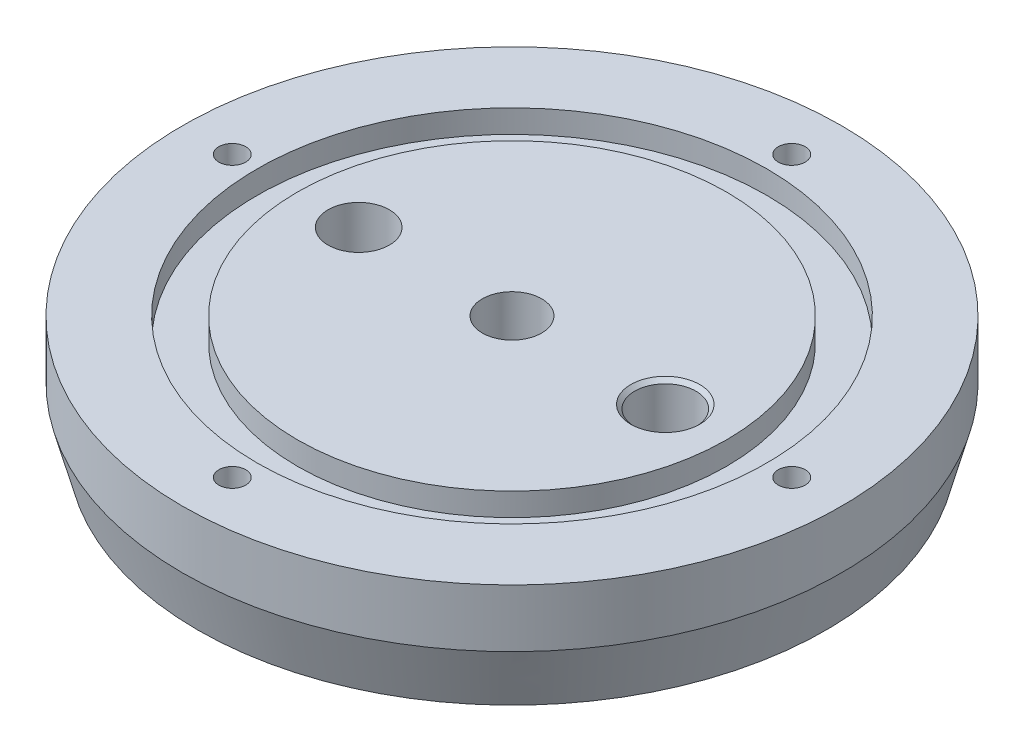
ISO-10303-21;
HEADER;
FILE_DESCRIPTION(('STEP AP214'),'2;1');
FILE_NAME('part.step','',(''),(''),'','','');
FILE_SCHEMA(('AUTOMOTIVE_DESIGN { 1 0 10303 214 1 1 1 1 }'));
ENDSEC;
DATA;
#1=APPLICATION_CONTEXT('core data for automotive mechanical design processes');
#2=APPLICATION_PROTOCOL_DEFINITION('international standard','automotive_design',2000,#1);
#3=PRODUCT_CONTEXT('',#1,'mechanical');
#4=PRODUCT('Part','Part','',(#3));
#5=PRODUCT_RELATED_PRODUCT_CATEGORY('part','',(#4));
#6=PRODUCT_DEFINITION_FORMATION('','',#4);
#7=PRODUCT_DEFINITION_CONTEXT('part definition',#1,'design');
#8=PRODUCT_DEFINITION('design','',#6,#7);
#9=PRODUCT_DEFINITION_SHAPE('','',#8);
#10=(LENGTH_UNIT() NAMED_UNIT(*) SI_UNIT(.MILLI.,.METRE.));
#11=(NAMED_UNIT(*) PLANE_ANGLE_UNIT() SI_UNIT($,.RADIAN.));
#12=(NAMED_UNIT(*) SI_UNIT($,.STERADIAN.) SOLID_ANGLE_UNIT());
#13=UNCERTAINTY_MEASURE_WITH_UNIT(LENGTH_MEASURE(1.E-05),#10,'distance_accuracy_value','');
#14=(GEOMETRIC_REPRESENTATION_CONTEXT(3) GLOBAL_UNCERTAINTY_ASSIGNED_CONTEXT((#13)) GLOBAL_UNIT_ASSIGNED_CONTEXT((#10,
#11,#12)) REPRESENTATION_CONTEXT('',''));
#15=CARTESIAN_POINT('',(0.,0.,0.));
#16=DIRECTION('',(0.,0.,1.));
#17=DIRECTION('',(1.,0.,0.));
#18=AXIS2_PLACEMENT_3D('',#15,#16,#17);
#19=CARTESIAN_POINT('',(0.,15.,0.));
#20=DIRECTION('',(0.,1.,0.));
#21=DIRECTION('',(0.,0.,1.));
#22=AXIS2_PLACEMENT_3D('',#19,#20,#21);
#23=PLANE('',#22);
#24=CARTESIAN_POINT('',(20.,15.,0.));
#25=DIRECTION('',(0.,1.,0.));
#26=DIRECTION('',(0.,0.,1.));
#27=AXIS2_PLACEMENT_3D('',#24,#25,#26);
#28=CIRCLE('',#27,4.5);
#29=CARTESIAN_POINT('',(20.,15.,4.5));
#30=VERTEX_POINT('',#29);
#31=EDGE_CURVE('E42',#30,#30,#28,.F.);
#32=ORIENTED_EDGE('',*,*,#31,.T.);
#33=EDGE_LOOP('',(#32));
#34=FACE_BOUND('',#33,.T.);
#35=CARTESIAN_POINT('',(-20.,15.,0.));
#36=DIRECTION('',(0.,-1.,0.));
#37=DIRECTION('',(0.,0.,-1.));
#38=AXIS2_PLACEMENT_3D('',#35,#36,#37);
#39=CIRCLE('',#38,4.);
#40=CARTESIAN_POINT('',(-20.,15.,-4.));
#41=VERTEX_POINT('',#40);
#42=EDGE_CURVE('E72',#41,#41,#39,.T.);
#43=ORIENTED_EDGE('',*,*,#42,.T.);
#44=EDGE_LOOP('',(#43));
#45=FACE_BOUND('',#44,.T.);
#46=CARTESIAN_POINT('',(0.,15.,0.));
#47=DIRECTION('',(0.,1.,0.));
#48=DIRECTION('',(0.,0.,1.));
#49=AXIS2_PLACEMENT_3D('',#46,#47,#48);
#50=CIRCLE('',#49,3.875);
#51=CARTESIAN_POINT('',(0.,15.,3.875));
#52=VERTEX_POINT('',#51);
#53=EDGE_CURVE('E75',#52,#52,#50,.T.);
#54=ORIENTED_EDGE('',*,*,#53,.F.);
#55=EDGE_LOOP('',(#54));
#56=FACE_BOUND('',#55,.T.);
#57=CARTESIAN_POINT('',(0.,15.,0.));
#58=DIRECTION('',(0.,1.,0.));
#59=DIRECTION('',(0.,0.,1.));
#60=AXIS2_PLACEMENT_3D('',#57,#58,#59);
#61=CIRCLE('',#60,28.);
#62=CARTESIAN_POINT('',(0.,15.,28.));
#63=VERTEX_POINT('',#62);
#64=EDGE_CURVE('E85',#63,#63,#61,.T.);
#65=ORIENTED_EDGE('',*,*,#64,.T.);
#66=EDGE_LOOP('',(#65));
#67=FACE_BOUND('',#66,.T.);
#68=ADVANCED_FACE('F31',(#34,#45,#56,#67),#23,.T.);
#69=CARTESIAN_POINT('',(0.,15.,0.));
#70=DIRECTION('',(0.,-1.,0.));
#71=DIRECTION('',(0.,0.,-1.));
#72=AXIS2_PLACEMENT_3D('',#69,#70,#71);
#73=CYLINDRICAL_SURFACE('',#72,43.);
#74=CARTESIAN_POINT('',(0.,7.46410161513783,0.));
#75=DIRECTION('',(0.,1.,0.));
#76=DIRECTION('',(0.,0.,1.));
#77=AXIS2_PLACEMENT_3D('',#74,#75,#76);
#78=CIRCLE('',#77,43.);
#79=CARTESIAN_POINT('',(0.,7.46410161513783,43.));
#80=VERTEX_POINT('',#79);
#81=EDGE_CURVE('E66',#80,#80,#78,.T.);
#82=ORIENTED_EDGE('',*,*,#81,.T.);
#83=EDGE_LOOP('',(#82));
#84=FACE_BOUND('',#83,.T.);
#85=CARTESIAN_POINT('',(0.,15.,0.));
#86=DIRECTION('',(0.,1.,0.));
#87=DIRECTION('',(0.,0.,1.));
#88=AXIS2_PLACEMENT_3D('',#85,#86,#87);
#89=CIRCLE('',#88,43.);
#90=CARTESIAN_POINT('',(0.,15.,43.));
#91=VERTEX_POINT('',#90);
#92=EDGE_CURVE('E69',#91,#91,#89,.T.);
#93=ORIENTED_EDGE('',*,*,#92,.F.);
#94=EDGE_LOOP('',(#93));
#95=FACE_BOUND('',#94,.T.);
#96=ADVANCED_FACE('F155',(#84,#95),#73,.T.);
#97=CARTESIAN_POINT('',(-36.5,15.,0.));
#98=DIRECTION('',(0.,-1.,0.));
#99=DIRECTION('',(0.,0.,1.));
#100=AXIS2_PLACEMENT_3D('',#97,#98,#99);
#101=CIRCLE('',#100,1.75);
#102=CARTESIAN_POINT('',(-36.5,15.,1.75));
#103=VERTEX_POINT('',#102);
#104=EDGE_CURVE('E100',#103,#103,#101,.T.);
#105=ORIENTED_EDGE('',*,*,#104,.T.);
#106=EDGE_LOOP('',(#105));
#107=FACE_BOUND('',#106,.T.);
#108=CARTESIAN_POINT('',(3.82317206603323E-13,15.,-36.5));
#109=DIRECTION('',(0.,-1.,0.));
#110=DIRECTION('',(-1.,0.,0.));
#111=AXIS2_PLACEMENT_3D('',#108,#109,#110);
#112=CIRCLE('',#111,1.75);
#113=CARTESIAN_POINT('',(-1.74999999999962,15.,-36.5));
#114=VERTEX_POINT('',#113);
#115=EDGE_CURVE('E106',#114,#114,#112,.T.);
#116=ORIENTED_EDGE('',*,*,#115,.T.);
#117=EDGE_LOOP('',(#116));
#118=FACE_BOUND('',#117,.T.);
#119=CARTESIAN_POINT('',(-1.27439068867774E-13,15.,36.5));
#120=DIRECTION('',(0.,-1.,0.));
#121=DIRECTION('',(1.,0.,0.));
#122=AXIS2_PLACEMENT_3D('',#119,#120,#121);
#123=CIRCLE('',#122,1.75);
#124=CARTESIAN_POINT('',(1.74999999999988,15.,36.5));
#125=VERTEX_POINT('',#124);
#126=EDGE_CURVE('E94',#125,#125,#123,.T.);
#127=ORIENTED_EDGE('',*,*,#126,.T.);
#128=EDGE_LOOP('',(#127));
#129=FACE_BOUND('',#128,.T.);
#130=CARTESIAN_POINT('',(36.5,15.,0.));
#131=DIRECTION('',(0.,-1.,0.));
#132=DIRECTION('',(0.,0.,-1.));
#133=AXIS2_PLACEMENT_3D('',#130,#131,#132);
#134=CIRCLE('',#133,1.75);
#135=CARTESIAN_POINT('',(36.5,15.,-1.75));
#136=VERTEX_POINT('',#135);
#137=EDGE_CURVE('E88',#136,#136,#134,.T.);
#138=ORIENTED_EDGE('',*,*,#137,.T.);
#139=EDGE_LOOP('',(#138));
#140=FACE_BOUND('',#139,.T.);
#141=CARTESIAN_POINT('',(0.,15.,0.));
#142=DIRECTION('',(0.,1.,0.));
#143=DIRECTION('',(0.,0.,1.));
#144=AXIS2_PLACEMENT_3D('',#141,#142,#143);
#145=CIRCLE('',#144,33.25);
#146=CARTESIAN_POINT('',(0.,15.,33.25));
#147=VERTEX_POINT('',#146);
#148=EDGE_CURVE('E79',#147,#147,#145,.T.);
#149=ORIENTED_EDGE('',*,*,#148,.F.);
#150=EDGE_LOOP('',(#149));
#151=FACE_BOUND('',#150,.T.);
#152=ORIENTED_EDGE('',*,*,#92,.T.);
#153=EDGE_LOOP('',(#152));
#154=FACE_BOUND('',#153,.T.);
#155=ADVANCED_FACE('F115',(#107,#118,#129,#140,#151,#154),#23,.T.);
#156=CARTESIAN_POINT('',(0.,0.,0.));
#157=DIRECTION('',(0.,1.,0.));
#158=DIRECTION('',(0.,0.,1.));
#159=AXIS2_PLACEMENT_3D('',#156,#157,#158);
#160=PLANE('',#159);
#161=CARTESIAN_POINT('',(20.,0.,0.));
#162=DIRECTION('',(0.,1.,0.));
#163=DIRECTION('',(0.,0.,1.));
#164=AXIS2_PLACEMENT_3D('',#161,#162,#163);
#165=CIRCLE('',#164,4.49999999999998);
#166=CARTESIAN_POINT('',(20.,0.,4.49999999999998));
#167=VERTEX_POINT('',#166);
#168=EDGE_CURVE('E46',#167,#167,#165,.T.);
#169=ORIENTED_EDGE('',*,*,#168,.T.);
#170=EDGE_LOOP('',(#169));
#171=FACE_BOUND('',#170,.T.);
#172=CARTESIAN_POINT('',(0.,0.,0.));
#173=DIRECTION('',(0.,1.,0.));
#174=DIRECTION('',(0.,0.,1.));
#175=AXIS2_PLACEMENT_3D('',#172,#173,#174);
#176=CIRCLE('',#175,4.375);
#177=CARTESIAN_POINT('',(0.,0.,4.375));
#178=VERTEX_POINT('',#177);
#179=EDGE_CURVE('E51',#178,#178,#176,.T.);
#180=ORIENTED_EDGE('',*,*,#179,.T.);
#181=EDGE_LOOP('',(#180));
#182=FACE_BOUND('',#181,.T.);
#183=CARTESIAN_POINT('',(-20.,0.,0.));
#184=DIRECTION('',(0.,1.,0.));
#185=DIRECTION('',(0.,0.,1.));
#186=AXIS2_PLACEMENT_3D('',#183,#184,#185);
#187=CIRCLE('',#186,4.49999999999998);
#188=CARTESIAN_POINT('',(-20.,0.,4.49999999999998));
#189=VERTEX_POINT('',#188);
#190=EDGE_CURVE('E54',#189,#189,#187,.T.);
#191=ORIENTED_EDGE('',*,*,#190,.T.);
#192=EDGE_LOOP('',(#191));
#193=FACE_BOUND('',#192,.T.);
#194=CARTESIAN_POINT('',(0.,0.,0.));
#195=DIRECTION('',(0.,1.,0.));
#196=DIRECTION('',(0.,0.,1.));
#197=AXIS2_PLACEMENT_3D('',#194,#195,#196);
#198=CIRCLE('',#197,41.);
#199=CARTESIAN_POINT('',(0.,0.,41.));
#200=VERTEX_POINT('',#199);
#201=EDGE_CURVE('E63',#200,#200,#198,.F.);
#202=ORIENTED_EDGE('',*,*,#201,.T.);
#203=EDGE_LOOP('',(#202));
#204=FACE_BOUND('',#203,.T.);
#205=CARTESIAN_POINT('',(-36.5,0.,0.));
#206=DIRECTION('',(0.,-1.,0.));
#207=DIRECTION('',(0.,0.,1.));
#208=AXIS2_PLACEMENT_3D('',#205,#206,#207);
#209=CIRCLE('',#208,1.75);
#210=CARTESIAN_POINT('',(-36.5,0.,1.75));
#211=VERTEX_POINT('',#210);
#212=EDGE_CURVE('E109',#211,#211,#209,.T.);
#213=ORIENTED_EDGE('',*,*,#212,.F.);
#214=EDGE_LOOP('',(#213));
#215=FACE_BOUND('',#214,.T.);
#216=CARTESIAN_POINT('',(3.82317206603323E-13,0.,-36.5));
#217=DIRECTION('',(0.,-1.,0.));
#218=DIRECTION('',(-1.,0.,0.));
#219=AXIS2_PLACEMENT_3D('',#216,#217,#218);
#220=CIRCLE('',#219,1.75);
#221=CARTESIAN_POINT('',(-1.74999999999962,0.,-36.5));
#222=VERTEX_POINT('',#221);
#223=EDGE_CURVE('E103',#222,#222,#220,.T.);
#224=ORIENTED_EDGE('',*,*,#223,.F.);
#225=EDGE_LOOP('',(#224));
#226=FACE_BOUND('',#225,.T.);
#227=CARTESIAN_POINT('',(-1.27439068867774E-13,0.,36.5));
#228=DIRECTION('',(0.,-1.,0.));
#229=DIRECTION('',(1.,0.,0.));
#230=AXIS2_PLACEMENT_3D('',#227,#228,#229);
#231=CIRCLE('',#230,1.75);
#232=CARTESIAN_POINT('',(1.74999999999988,0.,36.5));
#233=VERTEX_POINT('',#232);
#234=EDGE_CURVE('E97',#233,#233,#231,.T.);
#235=ORIENTED_EDGE('',*,*,#234,.F.);
#236=EDGE_LOOP('',(#235));
#237=FACE_BOUND('',#236,.T.);
#238=CARTESIAN_POINT('',(36.5,0.,0.));
#239=DIRECTION('',(0.,-1.,0.));
#240=DIRECTION('',(0.,0.,-1.));
#241=AXIS2_PLACEMENT_3D('',#238,#239,#240);
#242=CIRCLE('',#241,1.75);
#243=CARTESIAN_POINT('',(36.5,0.,-1.75));
#244=VERTEX_POINT('',#243);
#245=EDGE_CURVE('E91',#244,#244,#242,.T.);
#246=ORIENTED_EDGE('',*,*,#245,.F.);
#247=EDGE_LOOP('',(#246));
#248=FACE_BOUND('',#247,.T.);
#249=ADVANCED_FACE('F126',(#171,#182,#193,#204,#215,#226,#237,#248),#160,.F.);
#250=CARTESIAN_POINT('',(20.,15.,0.));
#251=DIRECTION('',(0.,-1.,0.));
#252=DIRECTION('',(0.,0.,-1.));
#253=AXIS2_PLACEMENT_3D('',#250,#251,#252);
#254=CYLINDRICAL_SURFACE('',#253,4.);
#255=CARTESIAN_POINT('',(20.,0.499999999999962,0.));
#256=DIRECTION('',(0.,1.,0.));
#257=DIRECTION('',(0.,0.,1.));
#258=AXIS2_PLACEMENT_3D('',#255,#256,#257);
#259=CIRCLE('',#258,4.);
#260=CARTESIAN_POINT('',(20.,0.499999999999962,4.));
#261=VERTEX_POINT('',#260);
#262=EDGE_CURVE('E57',#261,#261,#259,.F.);
#263=ORIENTED_EDGE('',*,*,#262,.T.);
#264=EDGE_LOOP('',(#263));
#265=FACE_BOUND('',#264,.T.);
#266=CARTESIAN_POINT('',(20.,14.5,0.));
#267=DIRECTION('',(0.,1.,0.));
#268=DIRECTION('',(0.,0.,1.));
#269=AXIS2_PLACEMENT_3D('',#266,#267,#268);
#270=CIRCLE('',#269,4.);
#271=CARTESIAN_POINT('',(20.,14.5,4.));
#272=VERTEX_POINT('',#271);
#273=EDGE_CURVE('E60',#272,#272,#270,.T.);
#274=ORIENTED_EDGE('',*,*,#273,.T.);
#275=EDGE_LOOP('',(#274));
#276=FACE_BOUND('',#275,.T.);
#277=ADVANCED_FACE('F129',(#265,#276),#254,.F.);
#278=CARTESIAN_POINT('',(-20.,15.,0.));
#279=DIRECTION('',(0.,-1.,0.));
#280=DIRECTION('',(0.,0.,-1.));
#281=AXIS2_PLACEMENT_3D('',#278,#279,#280);
#282=CYLINDRICAL_SURFACE('',#281,4.);
#283=CARTESIAN_POINT('',(-20.,0.499999999999962,0.));
#284=DIRECTION('',(0.,1.,0.));
#285=DIRECTION('',(0.,0.,1.));
#286=AXIS2_PLACEMENT_3D('',#283,#284,#285);
#287=CIRCLE('',#286,4.);
#288=CARTESIAN_POINT('',(-20.,0.499999999999962,4.));
#289=VERTEX_POINT('',#288);
#290=EDGE_CURVE('E10',#289,#289,#287,.F.);
#291=ORIENTED_EDGE('',*,*,#290,.T.);
#292=EDGE_LOOP('',(#291));
#293=FACE_BOUND('',#292,.T.);
#294=ORIENTED_EDGE('',*,*,#42,.F.);
#295=EDGE_LOOP('',(#294));
#296=FACE_BOUND('',#295,.T.);
#297=ADVANCED_FACE('F185',(#293,#296),#282,.F.);
#298=CARTESIAN_POINT('',(0.,0.,0.));
#299=DIRECTION('',(0.,1.,0.));
#300=DIRECTION('',(0.,0.,1.));
#301=AXIS2_PLACEMENT_3D('',#298,#299,#300);
#302=CYLINDRICAL_SURFACE('',#301,3.875);
#303=CARTESIAN_POINT('',(0.,0.49999999999999,0.));
#304=DIRECTION('',(0.,1.,0.));
#305=DIRECTION('',(0.,0.,1.));
#306=AXIS2_PLACEMENT_3D('',#303,#304,#305);
#307=CIRCLE('',#306,3.875);
#308=CARTESIAN_POINT('',(0.,0.49999999999999,3.875));
#309=VERTEX_POINT('',#308);
#310=EDGE_CURVE('E38',#309,#309,#307,.F.);
#311=ORIENTED_EDGE('',*,*,#310,.T.);
#312=EDGE_LOOP('',(#311));
#313=FACE_BOUND('',#312,.T.);
#314=ORIENTED_EDGE('',*,*,#53,.T.);
#315=EDGE_LOOP('',(#314));
#316=FACE_BOUND('',#315,.T.);
#317=ADVANCED_FACE('F194',(#313,#316),#302,.F.);
#318=CARTESIAN_POINT('',(0.,12.,0.));
#319=DIRECTION('',(0.,1.,0.));
#320=DIRECTION('',(0.,0.,1.));
#321=AXIS2_PLACEMENT_3D('',#318,#319,#320);
#322=CYLINDRICAL_SURFACE('',#321,33.25);
#323=CARTESIAN_POINT('',(0.,12.,0.));
#324=DIRECTION('',(0.,1.,0.));
#325=DIRECTION('',(0.,0.,1.));
#326=AXIS2_PLACEMENT_3D('',#323,#324,#325);
#327=CIRCLE('',#326,33.25);
#328=CARTESIAN_POINT('',(0.,12.,33.25));
#329=VERTEX_POINT('',#328);
#330=EDGE_CURVE('E78',#329,#329,#327,.T.);
#331=ORIENTED_EDGE('',*,*,#330,.F.);
#332=EDGE_LOOP('',(#331));
#333=FACE_BOUND('',#332,.T.);
#334=ORIENTED_EDGE('',*,*,#148,.T.);
#335=EDGE_LOOP('',(#334));
#336=FACE_BOUND('',#335,.T.);
#337=ADVANCED_FACE('F203',(#333,#336),#322,.F.);
#338=CARTESIAN_POINT('',(0.,12.,0.));
#339=DIRECTION('',(0.,1.,0.));
#340=DIRECTION('',(0.,0.,1.));
#341=AXIS2_PLACEMENT_3D('',#338,#339,#340);
#342=PLANE('',#341);
#343=CARTESIAN_POINT('',(0.,12.,0.));
#344=DIRECTION('',(0.,1.,0.));
#345=DIRECTION('',(0.,0.,1.));
#346=AXIS2_PLACEMENT_3D('',#343,#344,#345);
#347=CIRCLE('',#346,28.);
#348=CARTESIAN_POINT('',(0.,12.,28.));
#349=VERTEX_POINT('',#348);
#350=EDGE_CURVE('E82',#349,#349,#347,.T.);
#351=ORIENTED_EDGE('',*,*,#350,.F.);
#352=EDGE_LOOP('',(#351));
#353=FACE_BOUND('',#352,.T.);
#354=ORIENTED_EDGE('',*,*,#330,.T.);
#355=EDGE_LOOP('',(#354));
#356=FACE_BOUND('',#355,.T.);
#357=ADVANCED_FACE('F150',(#353,#356),#342,.T.);
#358=CARTESIAN_POINT('',(0.,12.,0.));
#359=DIRECTION('',(0.,1.,0.));
#360=DIRECTION('',(0.,0.,1.));
#361=AXIS2_PLACEMENT_3D('',#358,#359,#360);
#362=CYLINDRICAL_SURFACE('',#361,28.);
#363=ORIENTED_EDGE('',*,*,#350,.T.);
#364=EDGE_LOOP('',(#363));
#365=FACE_BOUND('',#364,.T.);
#366=ORIENTED_EDGE('',*,*,#64,.F.);
#367=EDGE_LOOP('',(#366));
#368=FACE_BOUND('',#367,.T.);
#369=ADVANCED_FACE('F141',(#365,#368),#362,.T.);
#370=CARTESIAN_POINT('',(36.5,15.,0.));
#371=DIRECTION('',(0.,-1.,0.));
#372=DIRECTION('',(0.,0.,-1.));
#373=AXIS2_PLACEMENT_3D('',#370,#371,#372);
#374=CYLINDRICAL_SURFACE('',#373,1.75);
#375=ORIENTED_EDGE('',*,*,#137,.F.);
#376=EDGE_LOOP('',(#375));
#377=FACE_BOUND('',#376,.T.);
#378=ORIENTED_EDGE('',*,*,#245,.T.);
#379=EDGE_LOOP('',(#378));
#380=FACE_BOUND('',#379,.T.);
#381=ADVANCED_FACE('F138',(#377,#380),#374,.F.);
#382=CARTESIAN_POINT('',(-1.27439068867774E-13,15.,36.5));
#383=DIRECTION('',(0.,-1.,0.));
#384=DIRECTION('',(0.,0.,-1.));
#385=AXIS2_PLACEMENT_3D('',#382,#383,#384);
#386=CYLINDRICAL_SURFACE('',#385,1.75);
#387=ORIENTED_EDGE('',*,*,#126,.F.);
#388=EDGE_LOOP('',(#387));
#389=FACE_BOUND('',#388,.T.);
#390=ORIENTED_EDGE('',*,*,#234,.T.);
#391=EDGE_LOOP('',(#390));
#392=FACE_BOUND('',#391,.T.);
#393=ADVANCED_FACE('F140',(#389,#392),#386,.F.);
#394=CARTESIAN_POINT('',(3.82317206603323E-13,15.,-36.5));
#395=DIRECTION('',(0.,-1.,0.));
#396=DIRECTION('',(0.,0.,-1.));
#397=AXIS2_PLACEMENT_3D('',#394,#395,#396);
#398=CYLINDRICAL_SURFACE('',#397,1.75);
#399=ORIENTED_EDGE('',*,*,#115,.F.);
#400=EDGE_LOOP('',(#399));
#401=FACE_BOUND('',#400,.T.);
#402=ORIENTED_EDGE('',*,*,#223,.T.);
#403=EDGE_LOOP('',(#402));
#404=FACE_BOUND('',#403,.T.);
#405=ADVANCED_FACE('F122',(#401,#404),#398,.F.);
#406=CARTESIAN_POINT('',(-36.5,15.,0.));
#407=DIRECTION('',(0.,-1.,0.));
#408=DIRECTION('',(0.,0.,-1.));
#409=AXIS2_PLACEMENT_3D('',#406,#407,#408);
#410=CYLINDRICAL_SURFACE('',#409,1.75);
#411=ORIENTED_EDGE('',*,*,#104,.F.);
#412=EDGE_LOOP('',(#411));
#413=FACE_BOUND('',#412,.T.);
#414=ORIENTED_EDGE('',*,*,#212,.T.);
#415=EDGE_LOOP('',(#414));
#416=FACE_BOUND('',#415,.T.);
#417=ADVANCED_FACE('F118',(#413,#416),#410,.F.);
#418=CARTESIAN_POINT('',(0.,7.46410161513783,0.));
#419=DIRECTION('',(0.,1.,0.));
#420=DIRECTION('',(0.,0.,1.));
#421=AXIS2_PLACEMENT_3D('',#418,#419,#420);
#422=CONICAL_SURFACE('',#421,43.,0.261799387799151);
#423=CARTESIAN_POINT('',(0.,0.,41.));
#424=CARTESIAN_POINT('',(0.,0.0777510584910182,41.0208333333333));
#425=CARTESIAN_POINT('',(0.,0.155502116982037,41.0416666666666));
#426=CARTESIAN_POINT('',(0.,0.311004233964075,41.0833333333333));
#427=CARTESIAN_POINT('',(0.,0.388755292455094,41.1041666666666));
#428=CARTESIAN_POINT('',(0.,0.544257409437133,41.1458333333333));
#429=CARTESIAN_POINT('',(0.,0.622008467928152,41.1666666666666));
#430=CARTESIAN_POINT('',(0.,0.77751058491019,41.2083333333333));
#431=CARTESIAN_POINT('',(0.,0.855261643401209,41.2291666666666));
#432=CARTESIAN_POINT('',(0.,1.01076376038325,41.2708333333333));
#433=CARTESIAN_POINT('',(0.,1.08851481887427,41.2916666666666));
#434=CARTESIAN_POINT('',(0.,1.2440169358563,41.3333333333333));
#435=CARTESIAN_POINT('',(0.,1.32176799434732,41.3541666666666));
#436=CARTESIAN_POINT('',(0.,1.47727011132936,41.3958333333333));
#437=CARTESIAN_POINT('',(0.,1.55502116982038,41.4166666666666));
#438=CARTESIAN_POINT('',(0.,1.71052328680242,41.4583333333333));
#439=CARTESIAN_POINT('',(0.,1.78827434529344,41.4791666666666));
#440=CARTESIAN_POINT('',(0.,1.94377646227548,41.5208333333333));
#441=CARTESIAN_POINT('',(0.,2.0215275207665,41.5416666666666));
#442=CARTESIAN_POINT('',(0.,2.17702963774853,41.5833333333333));
#443=CARTESIAN_POINT('',(0.,2.25478069623955,41.6041666666666));
#444=CARTESIAN_POINT('',(0.,2.41028281322159,41.6458333333333));
#445=CARTESIAN_POINT('',(0.,2.48803387171261,41.6666666666666));
#446=CARTESIAN_POINT('',(0.,2.64353598869465,41.7083333333333));
#447=CARTESIAN_POINT('',(0.,2.72128704718567,41.7291666666666));
#448=CARTESIAN_POINT('',(0.,2.8767891641677,41.7708333333333));
#449=CARTESIAN_POINT('',(0.,2.95454022265872,41.7916666666666));
#450=CARTESIAN_POINT('',(0.,3.11004233964076,41.8333333333333));
#451=CARTESIAN_POINT('',(0.,3.18779339813178,41.8541666666667));
#452=CARTESIAN_POINT('',(0.,3.34329551511382,41.8958333333333));
#453=CARTESIAN_POINT('',(0.,3.42104657360484,41.9166666666667));
#454=CARTESIAN_POINT('',(0.,3.57654869058688,41.9583333333333));
#455=CARTESIAN_POINT('',(0.,3.6542997490779,41.9791666666667));
#456=CARTESIAN_POINT('',(0.,3.80980186605993,42.0208333333333));
#457=CARTESIAN_POINT('',(0.,3.88755292455095,42.0416666666667));
#458=CARTESIAN_POINT('',(0.,4.04305504153299,42.0833333333333));
#459=CARTESIAN_POINT('',(0.,4.12080610002401,42.1041666666667));
#460=CARTESIAN_POINT('',(0.,4.27630821700605,42.1458333333333));
#461=CARTESIAN_POINT('',(0.,4.35405927549707,42.1666666666667));
#462=CARTESIAN_POINT('',(0.,4.50956139247911,42.2083333333333));
#463=CARTESIAN_POINT('',(0.,4.58731245097013,42.2291666666666));
#464=CARTESIAN_POINT('',(0.,4.74281456795216,42.2708333333333));
#465=CARTESIAN_POINT('',(0.,4.82056562644318,42.2916666666667));
#466=CARTESIAN_POINT('',(0.,4.97606774342522,42.3333333333333));
#467=CARTESIAN_POINT('',(0.,5.05381880191624,42.3541666666667));
#468=CARTESIAN_POINT('',(0.,5.20932091889828,42.3958333333333));
#469=CARTESIAN_POINT('',(0.,5.2870719773893,42.4166666666667));
#470=CARTESIAN_POINT('',(0.,5.44257409437133,42.4583333333333));
#471=CARTESIAN_POINT('',(0.,5.52032515286235,42.4791666666667));
#472=CARTESIAN_POINT('',(0.,5.67582726984439,42.5208333333333));
#473=CARTESIAN_POINT('',(0.,5.75357832833541,42.5416666666667));
#474=CARTESIAN_POINT('',(0.,5.90908044531745,42.5833333333333));
#475=CARTESIAN_POINT('',(0.,5.98683150380847,42.6041666666667));
#476=CARTESIAN_POINT('',(0.,6.14233362079051,42.6458333333333));
#477=CARTESIAN_POINT('',(0.,6.22008467928152,42.6666666666667));
#478=CARTESIAN_POINT('',(0.,6.37558679626356,42.7083333333333));
#479=CARTESIAN_POINT('',(0.,6.45333785475458,42.7291666666667));
#480=CARTESIAN_POINT('',(0.,6.60883997173662,42.7708333333333));
#481=CARTESIAN_POINT('',(0.,6.68659103022764,42.7916666666667));
#482=CARTESIAN_POINT('',(0.,6.84209314720968,42.8333333333333));
#483=CARTESIAN_POINT('',(0.,6.9198442057007,42.8541666666667));
#484=CARTESIAN_POINT('',(0.,7.07534632268273,42.8958333333333));
#485=CARTESIAN_POINT('',(0.,7.15309738117375,42.9166666666667));
#486=CARTESIAN_POINT('',(0.,7.30859949815579,42.9583333333333));
#487=CARTESIAN_POINT('',(0.,7.38635055664681,42.9791666666667));
#488=CARTESIAN_POINT('',(0.,7.46410161513783,43.));
#489=B_SPLINE_CURVE_WITH_KNOTS('',3,(#423,#424,#425,#426,#427,#428,#429,#430,#431,#432,#433,
#434,#435,#436,#437,#438,#439,#440,#441,#442,#443,#444,#445,#446,#447,#448,#449,#450,#451,#452,
#453,#454,#455,#456,#457,#458,#459,#460,#461,#462,#463,#464,#465,#466,#467,#468,#469,#470,#471,
#472,#473,#474,#475,#476,#477,#478,#479,#480,#481,#482,#483,#484,#485,#486,#487,#488),
.UNSPECIFIED.,.F.,.F.,(4,2,2,2,2,2,2,2,2,2,2,2,2,2,2,2,2,2,2,2,2,2,2,2,2,2,2,2,2,2,2,2,4),(0.,
0.241481456572269,0.482962913144539,0.724444369716808,0.965925826289078,1.20740728286135,
1.44888873943362,1.69037019600589,1.93185165257816,2.17333310915043,2.4148145657227,
2.65629602229497,2.89777747886723,3.13925893543951,3.38074039201178,3.62222184858405,
3.86370330515631,4.10518476172859,4.34666621830085,4.58814767487312,4.82962913144539,
5.07111058801766,5.31259204458993,5.5540735011622,5.79555495773447,6.03703641430674,
6.27851787087901,6.51999932745128,6.76148078402355,7.00296224059582,7.24444369716809,
7.48592515374036,7.72740661031263),.UNSPECIFIED.);
#490=EDGE_CURVE('BSEAM121',#200,#80,#489,.T.);
#491=ORIENTED_EDGE('',*,*,#201,.F.);
#492=ORIENTED_EDGE('',*,*,#81,.F.);
#493=ORIENTED_EDGE('',*,*,#490,.T.);
#494=ORIENTED_EDGE('',*,*,#490,.F.);
#495=EDGE_LOOP('',(#491,#493,#492,#494));
#496=FACE_BOUND('',#495,.T.);
#497=ADVANCED_FACE('F121',(#496),#422,.T.);
#498=CARTESIAN_POINT('',(20.,0.499999999999962,0.));
#499=DIRECTION('',(0.,-1.,0.));
#500=DIRECTION('',(0.,0.,-1.));
#501=AXIS2_PLACEMENT_3D('',#498,#499,#500);
#502=CONICAL_SURFACE('',#501,4.,0.785398163397463);
#503=ORIENTED_EDGE('',*,*,#168,.F.);
#504=EDGE_LOOP('',(#503));
#505=FACE_BOUND('',#504,.T.);
#506=ORIENTED_EDGE('',*,*,#262,.F.);
#507=EDGE_LOOP('',(#506));
#508=FACE_BOUND('',#507,.T.);
#509=ADVANCED_FACE('F255',(#505,#508),#502,.F.);
#510=CARTESIAN_POINT('',(20.,15.,0.));
#511=DIRECTION('',(0.,1.,0.));
#512=DIRECTION('',(0.,0.,1.));
#513=AXIS2_PLACEMENT_3D('',#510,#511,#512);
#514=CONICAL_SURFACE('',#513,4.5,0.785398163397463);
#515=ORIENTED_EDGE('',*,*,#273,.F.);
#516=EDGE_LOOP('',(#515));
#517=FACE_BOUND('',#516,.T.);
#518=ORIENTED_EDGE('',*,*,#31,.F.);
#519=EDGE_LOOP('',(#518));
#520=FACE_BOUND('',#519,.T.);
#521=ADVANCED_FACE('F263',(#517,#520),#514,.F.);
#522=CARTESIAN_POINT('',(0.,0.,0.));
#523=DIRECTION('',(0.,-1.,0.));
#524=DIRECTION('',(0.,0.,-1.));
#525=AXIS2_PLACEMENT_3D('',#522,#523,#524);
#526=CONICAL_SURFACE('',#525,4.375,0.785398163397462);
#527=ORIENTED_EDGE('',*,*,#310,.F.);
#528=EDGE_LOOP('',(#527));
#529=FACE_BOUND('',#528,.T.);
#530=ORIENTED_EDGE('',*,*,#179,.F.);
#531=EDGE_LOOP('',(#530));
#532=FACE_BOUND('',#531,.T.);
#533=ADVANCED_FACE('F272',(#529,#532),#526,.F.);
#534=CARTESIAN_POINT('',(-20.,0.499999999999962,0.));
#535=DIRECTION('',(0.,-1.,0.));
#536=DIRECTION('',(0.,0.,-1.));
#537=AXIS2_PLACEMENT_3D('',#534,#535,#536);
#538=CONICAL_SURFACE('',#537,4.,0.785398163397463);
#539=ORIENTED_EDGE('',*,*,#190,.F.);
#540=EDGE_LOOP('',(#539));
#541=FACE_BOUND('',#540,.T.);
#542=ORIENTED_EDGE('',*,*,#290,.F.);
#543=EDGE_LOOP('',(#542));
#544=FACE_BOUND('',#543,.T.);
#545=ADVANCED_FACE('F33',(#541,#544),#538,.F.);
#546=CLOSED_SHELL('',(#68,#96,#155,#249,#277,#297,#317,#337,#357,#369,#381,#393,#405,#417,#497,
#509,#521,#533,#545));
#547=MANIFOLD_SOLID_BREP('B2',#546);
#548=ADVANCED_BREP_SHAPE_REPRESENTATION('',(#18,#547),#14);
#549=SHAPE_DEFINITION_REPRESENTATION(#9,#548);
ENDSEC;
END-ISO-10303-21;
